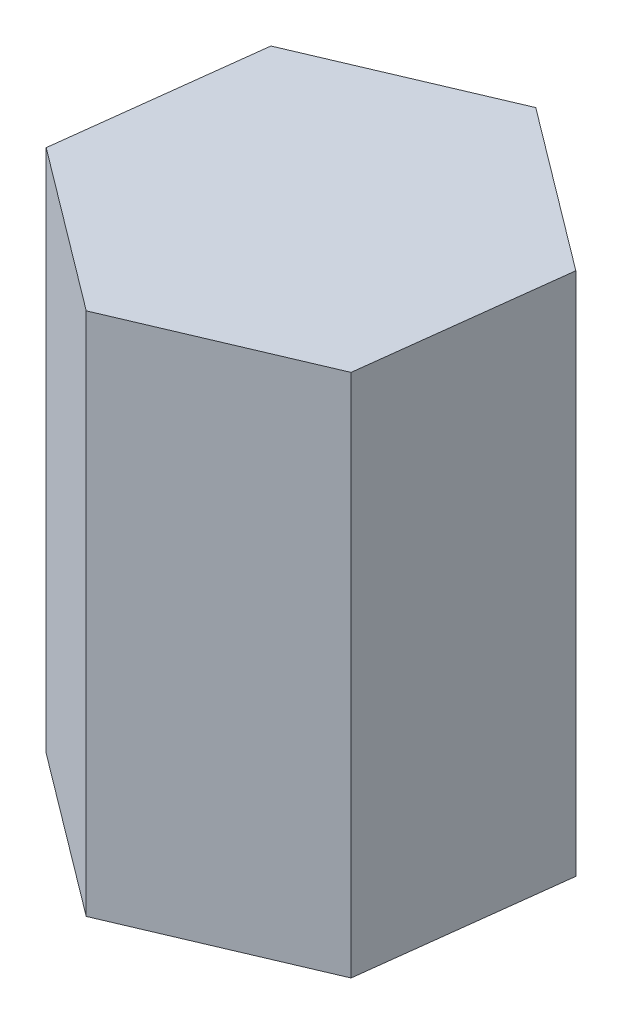
ISO-10303-21;
HEADER;
FILE_DESCRIPTION(('STEP AP214'),'2;1');
FILE_NAME('part.step','',(''),(''),'','','');
FILE_SCHEMA(('AUTOMOTIVE_DESIGN { 1 0 10303 214 1 1 1 1 }'));
ENDSEC;
DATA;
#1=APPLICATION_CONTEXT('core data for automotive mechanical design processes');
#2=APPLICATION_PROTOCOL_DEFINITION('international standard','automotive_design',2000,#1);
#3=PRODUCT_CONTEXT('',#1,'mechanical');
#4=PRODUCT('Part','Part','',(#3));
#5=PRODUCT_RELATED_PRODUCT_CATEGORY('part','',(#4));
#6=PRODUCT_DEFINITION_FORMATION('','',#4);
#7=PRODUCT_DEFINITION_CONTEXT('part definition',#1,'design');
#8=PRODUCT_DEFINITION('design','',#6,#7);
#9=PRODUCT_DEFINITION_SHAPE('','',#8);
#10=(LENGTH_UNIT() NAMED_UNIT(*) SI_UNIT(.MILLI.,.METRE.));
#11=(NAMED_UNIT(*) PLANE_ANGLE_UNIT() SI_UNIT($,.RADIAN.));
#12=(NAMED_UNIT(*) SI_UNIT($,.STERADIAN.) SOLID_ANGLE_UNIT());
#13=UNCERTAINTY_MEASURE_WITH_UNIT(LENGTH_MEASURE(1.E-05),#10,'distance_accuracy_value','');
#14=(GEOMETRIC_REPRESENTATION_CONTEXT(3) GLOBAL_UNCERTAINTY_ASSIGNED_CONTEXT((#13)) GLOBAL_UNIT_ASSIGNED_CONTEXT((#10,
#11,#12)) REPRESENTATION_CONTEXT('',''));
#15=CARTESIAN_POINT('',(0.,0.,0.));
#16=DIRECTION('',(0.,0.,1.));
#17=DIRECTION('',(1.,0.,0.));
#18=AXIS2_PLACEMENT_3D('',#15,#16,#17);
#19=CARTESIAN_POINT('',(-0.348459145534174,7.5,2.86564295703896));
#20=DIRECTION('',(-0.391806176134086,0.,-0.920047781554407));
#21=DIRECTION('',(-0.920047781554407,0.,0.391806176134086));
#22=AXIS2_PLACEMENT_3D('',#19,#20,#21);
#23=PLANE('',#22);
#24=DIRECTION('',(0.920047781554407,0.,-0.391806176134086));
#25=VECTOR('',#24,1.);
#26=CARTESIAN_POINT('',(-0.348459145534174,0.,2.86564295703896));
#27=LINE('',#26,#25);
#28=CARTESIAN_POINT('',(-0.348459145534174,0.,2.86564295703896));
#29=VERTEX_POINT('',#28);
#30=CARTESIAN_POINT('',(2.30749002620461,0.,1.73459595073309));
#31=VERTEX_POINT('',#30);
#32=EDGE_CURVE('E128',#29,#31,#27,.T.);
#33=ORIENTED_EDGE('',*,*,#32,.T.);
#34=DIRECTION('',(0.,-1.,0.));
#35=VECTOR('',#34,1.);
#36=CARTESIAN_POINT('',(2.30749002620461,7.5,1.73459595073309));
#37=LINE('',#36,#35);
#38=CARTESIAN_POINT('',(2.30749002620461,7.5,1.73459595073309));
#39=VERTEX_POINT('',#38);
#40=EDGE_CURVE('E11',#39,#31,#37,.T.);
#41=ORIENTED_EDGE('',*,*,#40,.F.);
#42=DIRECTION('',(0.920047781554407,0.,-0.391806176134086));
#43=VECTOR('',#42,1.);
#44=CARTESIAN_POINT('',(-0.348459145534174,7.5,2.86564295703896));
#45=LINE('',#44,#43);
#46=CARTESIAN_POINT('',(-0.348459145534174,7.5,2.86564295703896));
#47=VERTEX_POINT('',#46);
#48=EDGE_CURVE('E144',#47,#39,#45,.T.);
#49=ORIENTED_EDGE('',*,*,#48,.F.);
#50=DIRECTION('',(0.,-1.,0.));
#51=VECTOR('',#50,1.);
#52=CARTESIAN_POINT('',(-0.348459145534174,7.5,2.86564295703896));
#53=LINE('',#52,#51);
#54=EDGE_CURVE('E124',#47,#29,#53,.T.);
#55=ORIENTED_EDGE('',*,*,#54,.T.);
#56=EDGE_LOOP('',(#33,#41,#49,#55));
#57=FACE_BOUND('',#56,.T.);
#58=ADVANCED_FACE('F39',(#57),#23,.F.);
#59=CARTESIAN_POINT('',(2.30749002620461,7.5,1.73459595073309));
#60=DIRECTION('',(-0.992687839588675,0.,-0.120709788885445));
#61=DIRECTION('',(-0.120709788885445,0.,0.992687839588675));
#62=AXIS2_PLACEMENT_3D('',#59,#60,#61);
#63=PLANE('',#62);
#64=DIRECTION('',(0.120709788885445,0.,-0.992687839588675));
#65=VECTOR('',#64,1.);
#66=CARTESIAN_POINT('',(2.30749002620461,0.,1.73459595073309));
#67=LINE('',#66,#65);
#68=CARTESIAN_POINT('',(2.65594917173878,0.,-1.13104700630588));
#69=VERTEX_POINT('',#68);
#70=EDGE_CURVE('E132',#31,#69,#67,.T.);
#71=ORIENTED_EDGE('',*,*,#70,.T.);
#72=DIRECTION('',(0.,-1.,0.));
#73=VECTOR('',#72,1.);
#74=CARTESIAN_POINT('',(2.65594917173878,7.5,-1.13104700630588));
#75=LINE('',#74,#73);
#76=CARTESIAN_POINT('',(2.65594917173878,7.5,-1.13104700630588));
#77=VERTEX_POINT('',#76);
#78=EDGE_CURVE('E48',#77,#69,#75,.T.);
#79=ORIENTED_EDGE('',*,*,#78,.F.);
#80=DIRECTION('',(0.120709788885445,0.,-0.992687839588675));
#81=VECTOR('',#80,1.);
#82=CARTESIAN_POINT('',(2.30749002620461,7.5,1.73459595073309));
#83=LINE('',#82,#81);
#84=EDGE_CURVE('E93',#39,#77,#83,.T.);
#85=ORIENTED_EDGE('',*,*,#84,.F.);
#86=ORIENTED_EDGE('',*,*,#40,.T.);
#87=EDGE_LOOP('',(#71,#79,#85,#86));
#88=FACE_BOUND('',#87,.T.);
#89=ADVANCED_FACE('F172',(#88),#63,.F.);
#90=CARTESIAN_POINT('',(2.65594917173878,7.5,-1.13104700630588));
#91=DIRECTION('',(-0.60088166345459,0.,0.799337992668962));
#92=DIRECTION('',(0.799337992668962,0.,0.60088166345459));
#93=AXIS2_PLACEMENT_3D('',#90,#91,#92);
#94=PLANE('',#93);
#95=DIRECTION('',(-0.799337992668962,0.,-0.60088166345459));
#96=VECTOR('',#95,1.);
#97=CARTESIAN_POINT('',(2.65594917173878,0.,-1.13104700630588));
#98=LINE('',#97,#96);
#99=CARTESIAN_POINT('',(0.34845914553417,0.,-2.86564295703897));
#100=VERTEX_POINT('',#99);
#101=EDGE_CURVE('E135',#69,#100,#98,.T.);
#102=ORIENTED_EDGE('',*,*,#101,.T.);
#103=DIRECTION('',(0.,-1.,0.));
#104=VECTOR('',#103,1.);
#105=CARTESIAN_POINT('',(0.34845914553417,7.5,-2.86564295703897));
#106=LINE('',#105,#104);
#107=CARTESIAN_POINT('',(0.34845914553417,7.5,-2.86564295703897));
#108=VERTEX_POINT('',#107);
#109=EDGE_CURVE('E117',#108,#100,#106,.T.);
#110=ORIENTED_EDGE('',*,*,#109,.F.);
#111=DIRECTION('',(-0.799337992668962,0.,-0.60088166345459));
#112=VECTOR('',#111,1.);
#113=CARTESIAN_POINT('',(2.65594917173878,7.5,-1.13104700630588));
#114=LINE('',#113,#112);
#115=EDGE_CURVE('E106',#77,#108,#114,.T.);
#116=ORIENTED_EDGE('',*,*,#115,.F.);
#117=ORIENTED_EDGE('',*,*,#78,.T.);
#118=EDGE_LOOP('',(#102,#110,#116,#117));
#119=FACE_BOUND('',#118,.T.);
#120=ADVANCED_FACE('F154',(#119),#94,.F.);
#121=CARTESIAN_POINT('',(0.34845914553417,7.5,-2.86564295703897));
#122=DIRECTION('',(0.391806176134086,0.,0.920047781554407));
#123=DIRECTION('',(0.920047781554407,0.,-0.391806176134086));
#124=AXIS2_PLACEMENT_3D('',#121,#122,#123);
#125=PLANE('',#124);
#126=DIRECTION('',(-0.920047781554407,0.,0.391806176134086));
#127=VECTOR('',#126,1.);
#128=CARTESIAN_POINT('',(0.34845914553417,0.,-2.86564295703897));
#129=LINE('',#128,#127);
#130=CARTESIAN_POINT('',(-2.30749002620461,0.,-1.73459595073311));
#131=VERTEX_POINT('',#130);
#132=EDGE_CURVE('E115',#100,#131,#129,.T.);
#133=ORIENTED_EDGE('',*,*,#132,.T.);
#134=DIRECTION('',(0.,-1.,0.));
#135=VECTOR('',#134,1.);
#136=CARTESIAN_POINT('',(-2.30749002620461,7.5,-1.73459595073311));
#137=LINE('',#136,#135);
#138=CARTESIAN_POINT('',(-2.30749002620461,7.5,-1.73459595073311));
#139=VERTEX_POINT('',#138);
#140=EDGE_CURVE('E112',#139,#131,#137,.T.);
#141=ORIENTED_EDGE('',*,*,#140,.F.);
#142=DIRECTION('',(-0.920047781554407,0.,0.391806176134086));
#143=VECTOR('',#142,1.);
#144=CARTESIAN_POINT('',(0.34845914553417,7.5,-2.86564295703897));
#145=LINE('',#144,#143);
#146=EDGE_CURVE('E100',#108,#139,#145,.T.);
#147=ORIENTED_EDGE('',*,*,#146,.F.);
#148=ORIENTED_EDGE('',*,*,#109,.T.);
#149=EDGE_LOOP('',(#133,#141,#147,#148));
#150=FACE_BOUND('',#149,.T.);
#151=ADVANCED_FACE('F113',(#150),#125,.F.);
#152=CARTESIAN_POINT('',(-2.30749002620461,7.5,-1.73459595073311));
#153=DIRECTION('',(0.992687839588675,0.,0.120709788885444));
#154=DIRECTION('',(0.120709788885444,0.,-0.992687839588675));
#155=AXIS2_PLACEMENT_3D('',#152,#153,#154);
#156=PLANE('',#155);
#157=DIRECTION('',(-0.120709788885444,0.,0.992687839588675));
#158=VECTOR('',#157,1.);
#159=CARTESIAN_POINT('',(-2.30749002620461,0.,-1.73459595073311));
#160=LINE('',#159,#158);
#161=CARTESIAN_POINT('',(-2.65594917173878,0.,1.13104700630586));
#162=VERTEX_POINT('',#161);
#163=EDGE_CURVE('E79',#131,#162,#160,.T.);
#164=ORIENTED_EDGE('',*,*,#163,.T.);
#165=DIRECTION('',(0.,-1.,0.));
#166=VECTOR('',#165,1.);
#167=CARTESIAN_POINT('',(-2.65594917173878,7.5,1.13104700630586));
#168=LINE('',#167,#166);
#169=CARTESIAN_POINT('',(-2.65594917173878,7.5,1.13104700630586));
#170=VERTEX_POINT('',#169);
#171=EDGE_CURVE('E118',#170,#162,#168,.T.);
#172=ORIENTED_EDGE('',*,*,#171,.F.);
#173=DIRECTION('',(-0.120709788885444,0.,0.992687839588675));
#174=VECTOR('',#173,1.);
#175=CARTESIAN_POINT('',(-2.30749002620461,7.5,-1.73459595073311));
#176=LINE('',#175,#174);
#177=EDGE_CURVE('E104',#139,#170,#176,.T.);
#178=ORIENTED_EDGE('',*,*,#177,.F.);
#179=ORIENTED_EDGE('',*,*,#140,.T.);
#180=EDGE_LOOP('',(#164,#172,#178,#179));
#181=FACE_BOUND('',#180,.T.);
#182=ADVANCED_FACE('F120',(#181),#156,.F.);
#183=CARTESIAN_POINT('',(-2.65594917173878,7.5,1.13104700630586));
#184=DIRECTION('',(0.600881663454589,0.,-0.799337992668962));
#185=DIRECTION('',(-0.799337992668962,0.,-0.600881663454589));
#186=AXIS2_PLACEMENT_3D('',#183,#184,#185);
#187=PLANE('',#186);
#188=DIRECTION('',(0.799337992668962,0.,0.600881663454589));
#189=VECTOR('',#188,1.);
#190=CARTESIAN_POINT('',(-2.65594917173878,0.,1.13104700630586));
#191=LINE('',#190,#189);
#192=EDGE_CURVE('E85',#162,#29,#191,.T.);
#193=ORIENTED_EDGE('',*,*,#192,.T.);
#194=ORIENTED_EDGE('',*,*,#54,.F.);
#195=DIRECTION('',(0.799337992668962,0.,0.600881663454589));
#196=VECTOR('',#195,1.);
#197=CARTESIAN_POINT('',(-2.65594917173878,7.5,1.13104700630586));
#198=LINE('',#197,#196);
#199=EDGE_CURVE('E56',#170,#47,#198,.T.);
#200=ORIENTED_EDGE('',*,*,#199,.F.);
#201=ORIENTED_EDGE('',*,*,#171,.T.);
#202=EDGE_LOOP('',(#193,#194,#200,#201));
#203=FACE_BOUND('',#202,.T.);
#204=ADVANCED_FACE('F161',(#203),#187,.F.);
#205=CARTESIAN_POINT('',(0.,7.5,0.));
#206=DIRECTION('',(0.,1.,0.));
#207=DIRECTION('',(0.,0.,1.));
#208=AXIS2_PLACEMENT_3D('',#205,#206,#207);
#209=PLANE('',#208);
#210=ORIENTED_EDGE('',*,*,#48,.T.);
#211=ORIENTED_EDGE('',*,*,#84,.T.);
#212=ORIENTED_EDGE('',*,*,#115,.T.);
#213=ORIENTED_EDGE('',*,*,#146,.T.);
#214=ORIENTED_EDGE('',*,*,#177,.T.);
#215=ORIENTED_EDGE('',*,*,#199,.T.);
#216=EDGE_LOOP('',(#210,#211,#212,#213,#214,#215));
#217=FACE_BOUND('',#216,.T.);
#218=ADVANCED_FACE('F102',(#217),#209,.T.);
#219=CARTESIAN_POINT('',(0.,0.,0.));
#220=DIRECTION('',(0.,1.,0.));
#221=DIRECTION('',(0.,0.,1.));
#222=AXIS2_PLACEMENT_3D('',#219,#220,#221);
#223=PLANE('',#222);
#224=ORIENTED_EDGE('',*,*,#32,.F.);
#225=ORIENTED_EDGE('',*,*,#192,.F.);
#226=ORIENTED_EDGE('',*,*,#163,.F.);
#227=ORIENTED_EDGE('',*,*,#132,.F.);
#228=ORIENTED_EDGE('',*,*,#101,.F.);
#229=ORIENTED_EDGE('',*,*,#70,.F.);
#230=EDGE_LOOP('',(#224,#225,#226,#227,#228,#229));
#231=FACE_BOUND('',#230,.T.);
#232=ADVANCED_FACE('F157',(#231),#223,.F.);
#233=CLOSED_SHELL('',(#58,#89,#120,#151,#182,#204,#218,#232));
#234=MANIFOLD_SOLID_BREP('B2',#233);
#235=ADVANCED_BREP_SHAPE_REPRESENTATION('',(#18,#234),#14);
#236=SHAPE_DEFINITION_REPRESENTATION(#9,#235);
ENDSEC;
END-ISO-10303-21;
